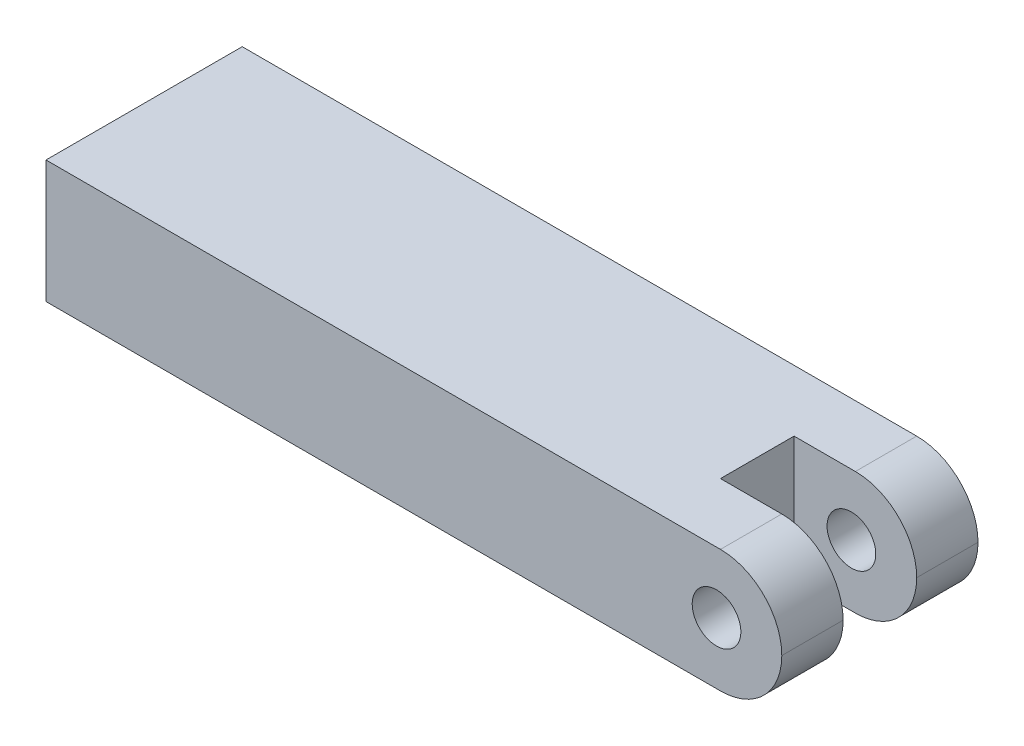
ISO-10303-21;
HEADER;
FILE_DESCRIPTION(('STEP AP214'),'2;1');
FILE_NAME('part.step','',(''),(''),'','','');
FILE_SCHEMA(('AUTOMOTIVE_DESIGN { 1 0 10303 214 1 1 1 1 }'));
ENDSEC;
DATA;
#1=APPLICATION_CONTEXT('core data for automotive mechanical design processes');
#2=APPLICATION_PROTOCOL_DEFINITION('international standard','automotive_design',2000,#1);
#3=PRODUCT_CONTEXT('',#1,'mechanical');
#4=PRODUCT('Part','Part','',(#3));
#5=PRODUCT_RELATED_PRODUCT_CATEGORY('part','',(#4));
#6=PRODUCT_DEFINITION_FORMATION('','',#4);
#7=PRODUCT_DEFINITION_CONTEXT('part definition',#1,'design');
#8=PRODUCT_DEFINITION('design','',#6,#7);
#9=PRODUCT_DEFINITION_SHAPE('','',#8);
#10=(LENGTH_UNIT() NAMED_UNIT(*) SI_UNIT(.MILLI.,.METRE.));
#11=(NAMED_UNIT(*) PLANE_ANGLE_UNIT() SI_UNIT($,.RADIAN.));
#12=(NAMED_UNIT(*) SI_UNIT($,.STERADIAN.) SOLID_ANGLE_UNIT());
#13=UNCERTAINTY_MEASURE_WITH_UNIT(LENGTH_MEASURE(1.E-05),#10,'distance_accuracy_value','');
#14=(GEOMETRIC_REPRESENTATION_CONTEXT(3) GLOBAL_UNCERTAINTY_ASSIGNED_CONTEXT((#13)) GLOBAL_UNIT_ASSIGNED_CONTEXT((#10,
#11,#12)) REPRESENTATION_CONTEXT('',''));
#15=CARTESIAN_POINT('',(0.,0.,0.));
#16=DIRECTION('',(0.,0.,1.));
#17=DIRECTION('',(1.,0.,0.));
#18=AXIS2_PLACEMENT_3D('',#15,#16,#17);
#19=CARTESIAN_POINT('',(50.,10.,32.));
#20=DIRECTION('',(-1.,0.,0.));
#21=DIRECTION('',(0.,0.,1.));
#22=AXIS2_PLACEMENT_3D('',#19,#20,#21);
#23=PLANE('',#22);
#24=DIRECTION('',(0.,-1.,0.));
#25=VECTOR('',#24,1.);
#26=CARTESIAN_POINT('',(50.,10.,10.));
#27=LINE('',#26,#25);
#28=CARTESIAN_POINT('',(50.,10.,10.));
#29=VERTEX_POINT('',#28);
#30=CARTESIAN_POINT('',(50.,-9.99999999999999,10.));
#31=VERTEX_POINT('',#30);
#32=EDGE_CURVE('E127',#29,#31,#27,.T.);
#33=ORIENTED_EDGE('',*,*,#32,.F.);
#34=DIRECTION('',(0.,0.,-1.));
#35=VECTOR('',#34,1.);
#36=CARTESIAN_POINT('',(50.,10.,32.));
#37=LINE('',#36,#35);
#38=CARTESIAN_POINT('',(50.,10.,22.));
#39=VERTEX_POINT('',#38);
#40=EDGE_CURVE('E112',#39,#29,#37,.T.);
#41=ORIENTED_EDGE('',*,*,#40,.F.);
#42=DIRECTION('',(0.,1.,0.));
#43=VECTOR('',#42,1.);
#44=CARTESIAN_POINT('',(50.,10.,22.));
#45=LINE('',#44,#43);
#46=CARTESIAN_POINT('',(50.,-9.99999999999999,22.));
#47=VERTEX_POINT('',#46);
#48=EDGE_CURVE('E119',#47,#39,#45,.T.);
#49=ORIENTED_EDGE('',*,*,#48,.F.);
#50=DIRECTION('',(0.,0.,-1.));
#51=VECTOR('',#50,1.);
#52=CARTESIAN_POINT('',(50.,-9.99999999999999,32.));
#53=LINE('',#52,#51);
#54=EDGE_CURVE('E128',#47,#31,#53,.T.);
#55=ORIENTED_EDGE('',*,*,#54,.T.);
#56=EDGE_LOOP('',(#33,#41,#49,#55));
#57=FACE_BOUND('',#56,.T.);
#58=ADVANCED_FACE('F33',(#57),#23,.F.);
#59=CARTESIAN_POINT('',(-50.,9.99999999999999,32.));
#60=DIRECTION('',(1.,0.,0.));
#61=DIRECTION('',(0.,1.,0.));
#62=AXIS2_PLACEMENT_3D('',#59,#60,#61);
#63=PLANE('',#62);
#64=DIRECTION('',(0.,-1.,0.));
#65=VECTOR('',#64,1.);
#66=CARTESIAN_POINT('',(-50.,9.99999999999999,0.));
#67=LINE('',#66,#65);
#68=CARTESIAN_POINT('',(-50.,9.99999999999999,0.));
#69=VERTEX_POINT('',#68);
#70=CARTESIAN_POINT('',(-50.,-10.,0.));
#71=VERTEX_POINT('',#70);
#72=EDGE_CURVE('E140',#69,#71,#67,.T.);
#73=ORIENTED_EDGE('',*,*,#72,.T.);
#74=DIRECTION('',(0.,0.,-1.));
#75=VECTOR('',#74,1.);
#76=CARTESIAN_POINT('',(-50.,-10.,32.));
#77=LINE('',#76,#75);
#78=CARTESIAN_POINT('',(-50.,-10.,32.));
#79=VERTEX_POINT('',#78);
#80=EDGE_CURVE('E159',#79,#71,#77,.T.);
#81=ORIENTED_EDGE('',*,*,#80,.F.);
#82=DIRECTION('',(0.,-1.,0.));
#83=VECTOR('',#82,1.);
#84=CARTESIAN_POINT('',(-50.,9.99999999999999,32.));
#85=LINE('',#84,#83);
#86=CARTESIAN_POINT('',(-50.,9.99999999999999,32.));
#87=VERTEX_POINT('',#86);
#88=EDGE_CURVE('E141',#87,#79,#85,.T.);
#89=ORIENTED_EDGE('',*,*,#88,.F.);
#90=DIRECTION('',(0.,0.,-1.));
#91=VECTOR('',#90,1.);
#92=CARTESIAN_POINT('',(-50.,9.99999999999999,32.));
#93=LINE('',#92,#91);
#94=EDGE_CURVE('E129',#87,#69,#93,.T.);
#95=ORIENTED_EDGE('',*,*,#94,.T.);
#96=EDGE_LOOP('',(#73,#81,#89,#95));
#97=FACE_BOUND('',#96,.T.);
#98=ADVANCED_FACE('F215',(#97),#63,.F.);
#99=CARTESIAN_POINT('',(50.,-9.99999999999999,32.));
#100=DIRECTION('',(0.,1.,0.));
#101=DIRECTION('',(-1.,0.,0.));
#102=AXIS2_PLACEMENT_3D('',#99,#100,#101);
#103=PLANE('',#102);
#104=DIRECTION('',(-1.,0.,0.));
#105=VECTOR('',#104,1.);
#106=CARTESIAN_POINT('',(70.,-9.99999999999999,22.));
#107=LINE('',#106,#105);
#108=CARTESIAN_POINT('',(60.,-9.99999999999999,22.));
#109=VERTEX_POINT('',#108);
#110=EDGE_CURVE('E118',#109,#47,#107,.T.);
#111=ORIENTED_EDGE('',*,*,#110,.F.);
#112=DIRECTION('',(0.,0.,-1.));
#113=VECTOR('',#112,1.);
#114=CARTESIAN_POINT('',(60.,-9.99999999999999,32.));
#115=LINE('',#114,#113);
#116=CARTESIAN_POINT('',(60.,-9.99999999999999,32.));
#117=VERTEX_POINT('',#116);
#118=EDGE_CURVE('E169',#109,#117,#115,.F.);
#119=ORIENTED_EDGE('',*,*,#118,.T.);
#120=DIRECTION('',(1.,0.,0.));
#121=VECTOR('',#120,1.);
#122=CARTESIAN_POINT('',(50.,-9.99999999999999,32.));
#123=LINE('',#122,#121);
#124=EDGE_CURVE('E144',#79,#117,#123,.T.);
#125=ORIENTED_EDGE('',*,*,#124,.F.);
#126=ORIENTED_EDGE('',*,*,#80,.T.);
#127=DIRECTION('',(1.,0.,0.));
#128=VECTOR('',#127,1.);
#129=CARTESIAN_POINT('',(50.,-9.99999999999999,0.));
#130=LINE('',#129,#128);
#131=CARTESIAN_POINT('',(60.,-9.99999999999999,0.));
#132=VERTEX_POINT('',#131);
#133=EDGE_CURVE('E152',#71,#132,#130,.T.);
#134=ORIENTED_EDGE('',*,*,#133,.T.);
#135=DIRECTION('',(0.,0.,-1.));
#136=VECTOR('',#135,1.);
#137=CARTESIAN_POINT('',(60.,-9.99999999999999,32.));
#138=LINE('',#137,#136);
#139=CARTESIAN_POINT('',(60.,-9.99999999999999,10.));
#140=VERTEX_POINT('',#139);
#141=EDGE_CURVE('E166',#132,#140,#138,.F.);
#142=ORIENTED_EDGE('',*,*,#141,.T.);
#143=DIRECTION('',(-1.,0.,0.));
#144=VECTOR('',#143,1.);
#145=CARTESIAN_POINT('',(70.,-9.99999999999999,10.));
#146=LINE('',#145,#144);
#147=EDGE_CURVE('E135',#140,#31,#146,.T.);
#148=ORIENTED_EDGE('',*,*,#147,.T.);
#149=ORIENTED_EDGE('',*,*,#54,.F.);
#150=EDGE_LOOP('',(#111,#119,#125,#126,#134,#142,#148,#149));
#151=FACE_BOUND('',#150,.T.);
#152=ADVANCED_FACE('F202',(#151),#103,.F.);
#153=CARTESIAN_POINT('',(50.,10.,32.));
#154=DIRECTION('',(0.,-1.,0.));
#155=DIRECTION('',(1.,0.,0.));
#156=AXIS2_PLACEMENT_3D('',#153,#154,#155);
#157=PLANE('',#156);
#158=DIRECTION('',(-1.,0.,0.));
#159=VECTOR('',#158,1.);
#160=CARTESIAN_POINT('',(70.,10.,10.));
#161=LINE('',#160,#159);
#162=CARTESIAN_POINT('',(60.,10.,10.));
#163=VERTEX_POINT('',#162);
#164=EDGE_CURVE('E133',#163,#29,#161,.T.);
#165=ORIENTED_EDGE('',*,*,#164,.F.);
#166=DIRECTION('',(0.,0.,1.));
#167=VECTOR('',#166,1.);
#168=CARTESIAN_POINT('',(60.,10.,32.));
#169=LINE('',#168,#167);
#170=CARTESIAN_POINT('',(60.,10.,0.));
#171=VERTEX_POINT('',#170);
#172=EDGE_CURVE('E11',#163,#171,#169,.F.);
#173=ORIENTED_EDGE('',*,*,#172,.T.);
#174=DIRECTION('',(-1.,0.,0.));
#175=VECTOR('',#174,1.);
#176=CARTESIAN_POINT('',(50.,10.,0.));
#177=LINE('',#176,#175);
#178=EDGE_CURVE('E145',#171,#69,#177,.T.);
#179=ORIENTED_EDGE('',*,*,#178,.T.);
#180=ORIENTED_EDGE('',*,*,#94,.F.);
#181=DIRECTION('',(-1.,0.,0.));
#182=VECTOR('',#181,1.);
#183=CARTESIAN_POINT('',(50.,10.,32.));
#184=LINE('',#183,#182);
#185=CARTESIAN_POINT('',(60.,10.,32.));
#186=VERTEX_POINT('',#185);
#187=EDGE_CURVE('E148',#186,#87,#184,.T.);
#188=ORIENTED_EDGE('',*,*,#187,.F.);
#189=DIRECTION('',(0.,0.,1.));
#190=VECTOR('',#189,1.);
#191=CARTESIAN_POINT('',(60.,10.,22.));
#192=LINE('',#191,#190);
#193=CARTESIAN_POINT('',(60.,10.,22.));
#194=VERTEX_POINT('',#193);
#195=EDGE_CURVE('E42',#186,#194,#192,.F.);
#196=ORIENTED_EDGE('',*,*,#195,.T.);
#197=DIRECTION('',(-1.,0.,0.));
#198=VECTOR('',#197,1.);
#199=CARTESIAN_POINT('',(70.,10.,22.));
#200=LINE('',#199,#198);
#201=EDGE_CURVE('E109',#194,#39,#200,.T.);
#202=ORIENTED_EDGE('',*,*,#201,.T.);
#203=ORIENTED_EDGE('',*,*,#40,.T.);
#204=EDGE_LOOP('',(#165,#173,#179,#180,#188,#196,#202,#203));
#205=FACE_BOUND('',#204,.T.);
#206=ADVANCED_FACE('F111',(#205),#157,.F.);
#207=CARTESIAN_POINT('',(0.,0.,32.));
#208=DIRECTION('',(0.,0.,-1.));
#209=DIRECTION('',(-1.,0.,0.));
#210=AXIS2_PLACEMENT_3D('',#207,#208,#209);
#211=PLANE('',#210);
#212=CARTESIAN_POINT('',(59.3541542404239,0.,32.));
#213=DIRECTION('',(0.,0.,-1.));
#214=DIRECTION('',(-1.,0.,0.));
#215=AXIS2_PLACEMENT_3D('',#212,#213,#214);
#216=CIRCLE('',#215,3.96875);
#217=CARTESIAN_POINT('',(55.3854042404239,0.,32.));
#218=VERTEX_POINT('',#217);
#219=EDGE_CURVE('E196',#218,#218,#216,.T.);
#220=ORIENTED_EDGE('',*,*,#219,.T.);
#221=EDGE_LOOP('',(#220));
#222=FACE_BOUND('',#221,.T.);
#223=ORIENTED_EDGE('',*,*,#124,.T.);
#224=CARTESIAN_POINT('',(60.,0.,32.));
#225=DIRECTION('',(0.,0.,-1.));
#226=DIRECTION('',(-1.,0.,0.));
#227=AXIS2_PLACEMENT_3D('',#224,#225,#226);
#228=CIRCLE('',#227,10.);
#229=CARTESIAN_POINT('',(70.,0.,32.));
#230=VERTEX_POINT('',#229);
#231=EDGE_CURVE('E174',#117,#230,#228,.F.);
#232=ORIENTED_EDGE('',*,*,#231,.T.);
#233=CARTESIAN_POINT('',(60.,0.,32.));
#234=DIRECTION('',(0.,0.,-1.));
#235=DIRECTION('',(-1.,0.,0.));
#236=AXIS2_PLACEMENT_3D('',#233,#234,#235);
#237=CIRCLE('',#236,10.);
#238=EDGE_CURVE('E172',#230,#186,#237,.F.);
#239=ORIENTED_EDGE('',*,*,#238,.T.);
#240=ORIENTED_EDGE('',*,*,#187,.T.);
#241=ORIENTED_EDGE('',*,*,#88,.T.);
#242=EDGE_LOOP('',(#223,#232,#239,#240,#241));
#243=FACE_BOUND('',#242,.T.);
#244=ADVANCED_FACE('F218',(#222,#243),#211,.F.);
#245=CARTESIAN_POINT('',(0.,0.,0.));
#246=DIRECTION('',(0.,0.,-1.));
#247=DIRECTION('',(-1.,0.,0.));
#248=AXIS2_PLACEMENT_3D('',#245,#246,#247);
#249=PLANE('',#248);
#250=CARTESIAN_POINT('',(59.3541542404239,0.,0.));
#251=DIRECTION('',(0.,0.,-1.));
#252=DIRECTION('',(-1.,0.,0.));
#253=AXIS2_PLACEMENT_3D('',#250,#251,#252);
#254=CIRCLE('',#253,3.96875);
#255=CARTESIAN_POINT('',(55.3854042404239,0.,0.));
#256=VERTEX_POINT('',#255);
#257=EDGE_CURVE('E199',#256,#256,#254,.T.);
#258=ORIENTED_EDGE('',*,*,#257,.F.);
#259=EDGE_LOOP('',(#258));
#260=FACE_BOUND('',#259,.T.);
#261=CARTESIAN_POINT('',(60.,0.,0.));
#262=DIRECTION('',(0.,0.,-1.));
#263=DIRECTION('',(-1.,0.,0.));
#264=AXIS2_PLACEMENT_3D('',#261,#262,#263);
#265=CIRCLE('',#264,10.);
#266=CARTESIAN_POINT('',(70.,0.,0.));
#267=VERTEX_POINT('',#266);
#268=EDGE_CURVE('E176',#171,#267,#265,.T.);
#269=ORIENTED_EDGE('',*,*,#268,.T.);
#270=CARTESIAN_POINT('',(60.,0.,0.));
#271=DIRECTION('',(0.,0.,-1.));
#272=DIRECTION('',(-1.,0.,0.));
#273=AXIS2_PLACEMENT_3D('',#270,#271,#272);
#274=CIRCLE('',#273,10.);
#275=EDGE_CURVE('E178',#267,#132,#274,.T.);
#276=ORIENTED_EDGE('',*,*,#275,.T.);
#277=ORIENTED_EDGE('',*,*,#133,.F.);
#278=ORIENTED_EDGE('',*,*,#72,.F.);
#279=ORIENTED_EDGE('',*,*,#178,.F.);
#280=EDGE_LOOP('',(#269,#276,#277,#278,#279));
#281=FACE_BOUND('',#280,.T.);
#282=ADVANCED_FACE('F210',(#260,#281),#249,.T.);
#283=CARTESIAN_POINT('',(70.,10.,22.));
#284=DIRECTION('',(0.,0.,1.));
#285=DIRECTION('',(1.,0.,0.));
#286=AXIS2_PLACEMENT_3D('',#283,#284,#285);
#287=PLANE('',#286);
#288=CARTESIAN_POINT('',(59.3541542404239,0.,22.));
#289=DIRECTION('',(0.,0.,1.));
#290=DIRECTION('',(1.,0.,0.));
#291=AXIS2_PLACEMENT_3D('',#288,#289,#290);
#292=CIRCLE('',#291,3.96875);
#293=CARTESIAN_POINT('',(63.3229042404239,0.,22.));
#294=VERTEX_POINT('',#293);
#295=EDGE_CURVE('E187',#294,#294,#292,.T.);
#296=ORIENTED_EDGE('',*,*,#295,.T.);
#297=EDGE_LOOP('',(#296));
#298=FACE_BOUND('',#297,.T.);
#299=CARTESIAN_POINT('',(60.,0.,22.));
#300=DIRECTION('',(0.,0.,1.));
#301=DIRECTION('',(1.,0.,0.));
#302=AXIS2_PLACEMENT_3D('',#299,#300,#301);
#303=CIRCLE('',#302,10.);
#304=CARTESIAN_POINT('',(70.,0.,22.));
#305=VERTEX_POINT('',#304);
#306=EDGE_CURVE('E162',#194,#305,#303,.F.);
#307=ORIENTED_EDGE('',*,*,#306,.T.);
#308=CARTESIAN_POINT('',(60.,0.,22.));
#309=DIRECTION('',(0.,0.,1.));
#310=DIRECTION('',(1.,0.,0.));
#311=AXIS2_PLACEMENT_3D('',#308,#309,#310);
#312=CIRCLE('',#311,10.);
#313=EDGE_CURVE('E164',#305,#109,#312,.F.);
#314=ORIENTED_EDGE('',*,*,#313,.T.);
#315=ORIENTED_EDGE('',*,*,#110,.T.);
#316=ORIENTED_EDGE('',*,*,#48,.T.);
#317=ORIENTED_EDGE('',*,*,#201,.F.);
#318=EDGE_LOOP('',(#307,#314,#315,#316,#317));
#319=FACE_BOUND('',#318,.T.);
#320=ADVANCED_FACE('F131',(#298,#319),#287,.F.);
#321=CARTESIAN_POINT('',(70.,10.,10.));
#322=DIRECTION('',(0.,0.,-1.));
#323=DIRECTION('',(-1.,0.,0.));
#324=AXIS2_PLACEMENT_3D('',#321,#322,#323);
#325=PLANE('',#324);
#326=CARTESIAN_POINT('',(59.3541542404239,0.,10.));
#327=DIRECTION('',(0.,0.,-1.));
#328=DIRECTION('',(-1.,0.,0.));
#329=AXIS2_PLACEMENT_3D('',#326,#327,#328);
#330=CIRCLE('',#329,3.96875);
#331=CARTESIAN_POINT('',(55.3854042404239,0.,10.));
#332=VERTEX_POINT('',#331);
#333=EDGE_CURVE('E37',#332,#332,#330,.T.);
#334=ORIENTED_EDGE('',*,*,#333,.T.);
#335=EDGE_LOOP('',(#334));
#336=FACE_BOUND('',#335,.T.);
#337=ORIENTED_EDGE('',*,*,#147,.F.);
#338=CARTESIAN_POINT('',(60.,0.,10.));
#339=DIRECTION('',(0.,0.,-1.));
#340=DIRECTION('',(-1.,0.,0.));
#341=AXIS2_PLACEMENT_3D('',#338,#339,#340);
#342=CIRCLE('',#341,10.);
#343=CARTESIAN_POINT('',(70.,0.,10.));
#344=VERTEX_POINT('',#343);
#345=EDGE_CURVE('E55',#140,#344,#342,.F.);
#346=ORIENTED_EDGE('',*,*,#345,.T.);
#347=CARTESIAN_POINT('',(60.,0.,10.));
#348=DIRECTION('',(0.,0.,-1.));
#349=DIRECTION('',(-1.,0.,0.));
#350=AXIS2_PLACEMENT_3D('',#347,#348,#349);
#351=CIRCLE('',#350,10.);
#352=EDGE_CURVE('E50',#344,#163,#351,.F.);
#353=ORIENTED_EDGE('',*,*,#352,.T.);
#354=ORIENTED_EDGE('',*,*,#164,.T.);
#355=ORIENTED_EDGE('',*,*,#32,.T.);
#356=EDGE_LOOP('',(#337,#346,#353,#354,#355));
#357=FACE_BOUND('',#356,.T.);
#358=ADVANCED_FACE('F204',(#336,#357),#325,.F.);
#359=CARTESIAN_POINT('',(60.,0.,0.));
#360=DIRECTION('',(0.,0.,-1.));
#361=DIRECTION('',(-1.,0.,0.));
#362=AXIS2_PLACEMENT_3D('',#359,#360,#361);
#363=CYLINDRICAL_SURFACE('',#362,10.);
#364=ORIENTED_EDGE('',*,*,#195,.F.);
#365=ORIENTED_EDGE('',*,*,#238,.F.);
#366=DIRECTION('',(0.,0.,1.));
#367=VECTOR('',#366,1.);
#368=CARTESIAN_POINT('',(70.,0.,32.));
#369=LINE('',#368,#367);
#370=EDGE_CURVE('E183',#305,#230,#369,.T.);
#371=ORIENTED_EDGE('',*,*,#370,.F.);
#372=ORIENTED_EDGE('',*,*,#306,.F.);
#373=EDGE_LOOP('',(#364,#365,#371,#372));
#374=FACE_BOUND('',#373,.T.);
#375=ADVANCED_FACE('F221',(#374),#363,.T.);
#376=CARTESIAN_POINT('',(60.,0.,0.));
#377=DIRECTION('',(0.,0.,1.));
#378=DIRECTION('',(1.,0.,0.));
#379=AXIS2_PLACEMENT_3D('',#376,#377,#378);
#380=CYLINDRICAL_SURFACE('',#379,10.);
#381=ORIENTED_EDGE('',*,*,#231,.F.);
#382=ORIENTED_EDGE('',*,*,#118,.F.);
#383=ORIENTED_EDGE('',*,*,#313,.F.);
#384=ORIENTED_EDGE('',*,*,#370,.T.);
#385=EDGE_LOOP('',(#381,#382,#383,#384));
#386=FACE_BOUND('',#385,.T.);
#387=ADVANCED_FACE('F226',(#386),#380,.T.);
#388=CARTESIAN_POINT('',(60.,0.,0.));
#389=DIRECTION('',(0.,0.,1.));
#390=DIRECTION('',(1.,0.,0.));
#391=AXIS2_PLACEMENT_3D('',#388,#389,#390);
#392=CYLINDRICAL_SURFACE('',#391,10.);
#393=ORIENTED_EDGE('',*,*,#172,.F.);
#394=ORIENTED_EDGE('',*,*,#352,.F.);
#395=DIRECTION('',(0.,0.,1.));
#396=VECTOR('',#395,1.);
#397=CARTESIAN_POINT('',(70.,0.,0.));
#398=LINE('',#397,#396);
#399=EDGE_CURVE('E185',#267,#344,#398,.T.);
#400=ORIENTED_EDGE('',*,*,#399,.F.);
#401=ORIENTED_EDGE('',*,*,#268,.F.);
#402=EDGE_LOOP('',(#393,#394,#400,#401));
#403=FACE_BOUND('',#402,.T.);
#404=ADVANCED_FACE('F35',(#403),#392,.T.);
#405=CARTESIAN_POINT('',(60.,0.,0.));
#406=DIRECTION('',(0.,0.,-1.));
#407=DIRECTION('',(-1.,0.,0.));
#408=AXIS2_PLACEMENT_3D('',#405,#406,#407);
#409=CYLINDRICAL_SURFACE('',#408,10.);
#410=ORIENTED_EDGE('',*,*,#345,.F.);
#411=ORIENTED_EDGE('',*,*,#141,.F.);
#412=ORIENTED_EDGE('',*,*,#275,.F.);
#413=ORIENTED_EDGE('',*,*,#399,.T.);
#414=EDGE_LOOP('',(#410,#411,#412,#413));
#415=FACE_BOUND('',#414,.T.);
#416=ADVANCED_FACE('F233',(#415),#409,.T.);
#417=CARTESIAN_POINT('',(59.3541542404239,0.,32.));
#418=DIRECTION('',(0.,0.,-1.));
#419=DIRECTION('',(-1.,0.,0.));
#420=AXIS2_PLACEMENT_3D('',#417,#418,#419);
#421=CYLINDRICAL_SURFACE('',#420,3.96875);
#422=ORIENTED_EDGE('',*,*,#257,.T.);
#423=EDGE_LOOP('',(#422));
#424=FACE_BOUND('',#423,.T.);
#425=ORIENTED_EDGE('',*,*,#333,.F.);
#426=EDGE_LOOP('',(#425));
#427=FACE_BOUND('',#426,.T.);
#428=ADVANCED_FACE('F266',(#424,#427),#421,.F.);
#429=ORIENTED_EDGE('',*,*,#219,.F.);
#430=EDGE_LOOP('',(#429));
#431=FACE_BOUND('',#430,.T.);
#432=ORIENTED_EDGE('',*,*,#295,.F.);
#433=EDGE_LOOP('',(#432));
#434=FACE_BOUND('',#433,.T.);
#435=ADVANCED_FACE('F264',(#431,#434),#421,.F.);
#436=CLOSED_SHELL('',(#58,#98,#152,#206,#244,#282,#320,#358,#375,#387,#404,#416,#428,#435));
#437=MANIFOLD_SOLID_BREP('B2',#436);
#438=ADVANCED_BREP_SHAPE_REPRESENTATION('',(#18,#437),#14);
#439=SHAPE_DEFINITION_REPRESENTATION(#9,#438);
ENDSEC;
END-ISO-10303-21;
